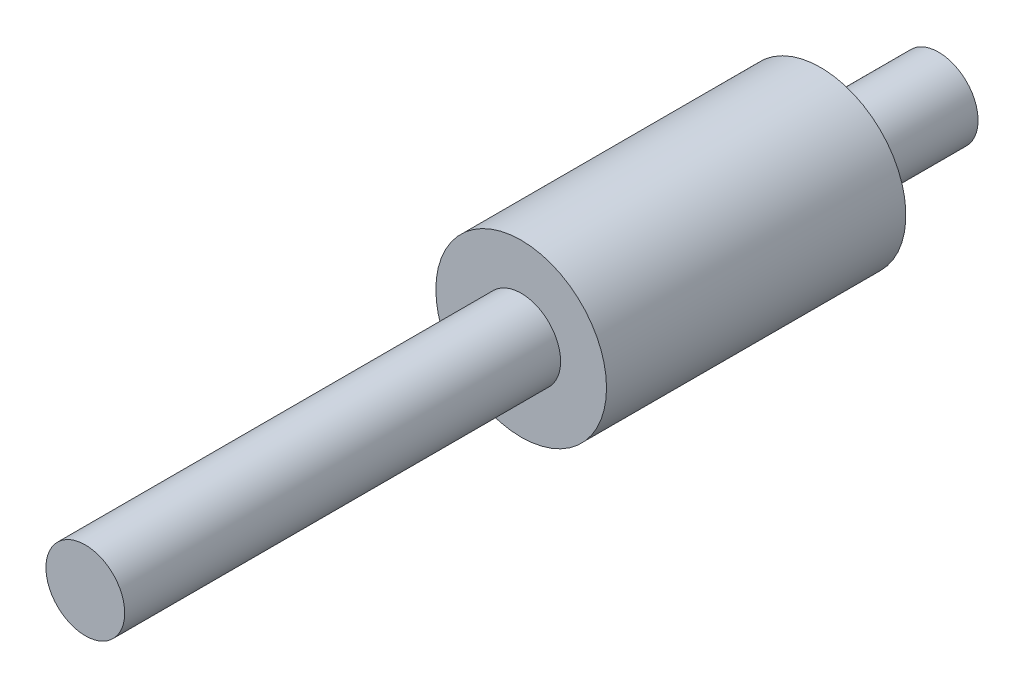
ISO-10303-21;
HEADER;
FILE_DESCRIPTION(('STEP AP214'),'2;1');
FILE_NAME('part.step','',(''),(''),'','','');
FILE_SCHEMA(('AUTOMOTIVE_DESIGN { 1 0 10303 214 1 1 1 1 }'));
ENDSEC;
DATA;
#1=APPLICATION_CONTEXT('core data for automotive mechanical design processes');
#2=APPLICATION_PROTOCOL_DEFINITION('international standard','automotive_design',2000,#1);
#3=PRODUCT_CONTEXT('',#1,'mechanical');
#4=PRODUCT('Part','Part','',(#3));
#5=PRODUCT_RELATED_PRODUCT_CATEGORY('part','',(#4));
#6=PRODUCT_DEFINITION_FORMATION('','',#4);
#7=PRODUCT_DEFINITION_CONTEXT('part definition',#1,'design');
#8=PRODUCT_DEFINITION('design','',#6,#7);
#9=PRODUCT_DEFINITION_SHAPE('','',#8);
#10=(LENGTH_UNIT() NAMED_UNIT(*) SI_UNIT(.MILLI.,.METRE.));
#11=(NAMED_UNIT(*) PLANE_ANGLE_UNIT() SI_UNIT($,.RADIAN.));
#12=(NAMED_UNIT(*) SI_UNIT($,.STERADIAN.) SOLID_ANGLE_UNIT());
#13=UNCERTAINTY_MEASURE_WITH_UNIT(LENGTH_MEASURE(1.E-05),#10,'distance_accuracy_value','');
#14=(GEOMETRIC_REPRESENTATION_CONTEXT(3) GLOBAL_UNCERTAINTY_ASSIGNED_CONTEXT((#13)) GLOBAL_UNIT_ASSIGNED_CONTEXT((#10,
#11,#12)) REPRESENTATION_CONTEXT('',''));
#15=CARTESIAN_POINT('',(0.,0.,0.));
#16=DIRECTION('',(0.,0.,1.));
#17=DIRECTION('',(1.,0.,0.));
#18=AXIS2_PLACEMENT_3D('',#15,#16,#17);
#19=CARTESIAN_POINT('',(0.,0.,65.));
#20=DIRECTION('',(0.,0.,-1.));
#21=DIRECTION('',(-1.,0.,0.));
#22=AXIS2_PLACEMENT_3D('',#19,#20,#21);
#23=CYLINDRICAL_SURFACE('',#22,6.5);
#24=CARTESIAN_POINT('',(0.,0.,31.8));
#25=DIRECTION('',(0.,0.,1.));
#26=DIRECTION('',(1.,0.,0.));
#27=AXIS2_PLACEMENT_3D('',#24,#25,#26);
#28=CIRCLE('',#27,6.5);
#29=CARTESIAN_POINT('',(6.5,0.,31.8));
#30=VERTEX_POINT('',#29);
#31=EDGE_CURVE('E10',#30,#30,#28,.T.);
#32=ORIENTED_EDGE('',*,*,#31,.F.);
#33=EDGE_LOOP('',(#32));
#34=FACE_BOUND('',#33,.T.);
#35=CARTESIAN_POINT('',(0.,0.,9.));
#36=DIRECTION('',(0.,0.,-1.));
#37=DIRECTION('',(-1.,0.,0.));
#38=AXIS2_PLACEMENT_3D('',#35,#36,#37);
#39=CIRCLE('',#38,6.5);
#40=CARTESIAN_POINT('',(-6.5,0.,9.));
#41=VERTEX_POINT('',#40);
#42=EDGE_CURVE('E47',#41,#41,#39,.T.);
#43=ORIENTED_EDGE('',*,*,#42,.F.);
#44=EDGE_LOOP('',(#43));
#45=FACE_BOUND('',#44,.T.);
#46=ADVANCED_FACE('F32',(#34,#45),#23,.T.);
#47=CARTESIAN_POINT('',(0.,0.,31.8));
#48=DIRECTION('',(0.,0.,1.));
#49=DIRECTION('',(1.,0.,0.));
#50=AXIS2_PLACEMENT_3D('',#47,#48,#49);
#51=PLANE('',#50);
#52=CARTESIAN_POINT('',(0.,0.,31.8));
#53=DIRECTION('',(0.,0.,1.));
#54=DIRECTION('',(1.,0.,0.));
#55=AXIS2_PLACEMENT_3D('',#52,#53,#54);
#56=CIRCLE('',#55,3.);
#57=CARTESIAN_POINT('',(3.,0.,31.8));
#58=VERTEX_POINT('',#57);
#59=EDGE_CURVE('E38',#58,#58,#56,.T.);
#60=ORIENTED_EDGE('',*,*,#59,.F.);
#61=EDGE_LOOP('',(#60));
#62=FACE_BOUND('',#61,.T.);
#63=ORIENTED_EDGE('',*,*,#31,.T.);
#64=EDGE_LOOP('',(#63));
#65=FACE_BOUND('',#64,.T.);
#66=ADVANCED_FACE('F69',(#62,#65),#51,.T.);
#67=CARTESIAN_POINT('',(0.,0.,31.8));
#68=DIRECTION('',(0.,0.,1.));
#69=DIRECTION('',(1.,0.,0.));
#70=AXIS2_PLACEMENT_3D('',#67,#68,#69);
#71=CYLINDRICAL_SURFACE('',#70,3.);
#72=CARTESIAN_POINT('',(0.,0.,65.));
#73=DIRECTION('',(0.,0.,1.));
#74=DIRECTION('',(1.,0.,0.));
#75=AXIS2_PLACEMENT_3D('',#72,#73,#74);
#76=CIRCLE('',#75,3.);
#77=CARTESIAN_POINT('',(3.,0.,65.));
#78=VERTEX_POINT('',#77);
#79=EDGE_CURVE('E42',#78,#78,#76,.T.);
#80=CARTESIAN_POINT('',(3.,0.,31.8));
#81=CARTESIAN_POINT('',(3.,0.,32.1458333333333));
#82=CARTESIAN_POINT('',(3.,0.,32.4916666666667));
#83=CARTESIAN_POINT('',(3.,0.,33.1833333333333));
#84=CARTESIAN_POINT('',(3.,0.,33.5291666666667));
#85=CARTESIAN_POINT('',(3.,0.,34.2208333333333));
#86=CARTESIAN_POINT('',(3.,0.,34.5666666666667));
#87=CARTESIAN_POINT('',(3.,0.,35.2583333333333));
#88=CARTESIAN_POINT('',(3.,0.,35.6041666666667));
#89=CARTESIAN_POINT('',(3.,0.,36.2958333333333));
#90=CARTESIAN_POINT('',(3.,0.,36.6416666666667));
#91=CARTESIAN_POINT('',(3.,0.,37.3333333333333));
#92=CARTESIAN_POINT('',(3.,0.,37.6791666666667));
#93=CARTESIAN_POINT('',(3.,0.,38.3708333333333));
#94=CARTESIAN_POINT('',(3.,0.,38.7166666666667));
#95=CARTESIAN_POINT('',(3.,0.,39.4083333333333));
#96=CARTESIAN_POINT('',(3.,0.,39.7541666666667));
#97=CARTESIAN_POINT('',(3.,0.,40.4458333333333));
#98=CARTESIAN_POINT('',(3.,0.,40.7916666666667));
#99=CARTESIAN_POINT('',(3.,0.,41.4833333333333));
#100=CARTESIAN_POINT('',(3.,0.,41.8291666666667));
#101=CARTESIAN_POINT('',(3.,0.,42.5208333333333));
#102=CARTESIAN_POINT('',(3.,0.,42.8666666666667));
#103=CARTESIAN_POINT('',(3.,0.,43.5583333333333));
#104=CARTESIAN_POINT('',(3.,0.,43.9041666666667));
#105=CARTESIAN_POINT('',(3.,0.,44.5958333333333));
#106=CARTESIAN_POINT('',(3.,0.,44.9416666666667));
#107=CARTESIAN_POINT('',(3.,0.,45.6333333333333));
#108=CARTESIAN_POINT('',(3.,0.,45.9791666666667));
#109=CARTESIAN_POINT('',(3.,0.,46.6708333333333));
#110=CARTESIAN_POINT('',(3.,0.,47.0166666666667));
#111=CARTESIAN_POINT('',(3.,0.,47.7083333333333));
#112=CARTESIAN_POINT('',(3.,0.,48.0541666666667));
#113=CARTESIAN_POINT('',(3.,0.,48.7458333333333));
#114=CARTESIAN_POINT('',(3.,0.,49.0916666666667));
#115=CARTESIAN_POINT('',(3.,0.,49.7833333333333));
#116=CARTESIAN_POINT('',(3.,0.,50.1291666666667));
#117=CARTESIAN_POINT('',(3.,0.,50.8208333333333));
#118=CARTESIAN_POINT('',(3.,0.,51.1666666666667));
#119=CARTESIAN_POINT('',(3.,0.,51.8583333333333));
#120=CARTESIAN_POINT('',(3.,0.,52.2041666666667));
#121=CARTESIAN_POINT('',(3.,0.,52.8958333333333));
#122=CARTESIAN_POINT('',(3.,0.,53.2416666666667));
#123=CARTESIAN_POINT('',(3.,0.,53.9333333333333));
#124=CARTESIAN_POINT('',(3.,0.,54.2791666666667));
#125=CARTESIAN_POINT('',(3.,0.,54.9708333333333));
#126=CARTESIAN_POINT('',(3.,0.,55.3166666666667));
#127=CARTESIAN_POINT('',(3.,0.,56.0083333333333));
#128=CARTESIAN_POINT('',(3.,0.,56.3541666666667));
#129=CARTESIAN_POINT('',(3.,0.,57.0458333333333));
#130=CARTESIAN_POINT('',(3.,0.,57.3916666666667));
#131=CARTESIAN_POINT('',(3.,0.,58.0833333333333));
#132=CARTESIAN_POINT('',(3.,0.,58.4291666666667));
#133=CARTESIAN_POINT('',(3.,0.,59.1208333333333));
#134=CARTESIAN_POINT('',(3.,0.,59.4666666666667));
#135=CARTESIAN_POINT('',(3.,0.,60.1583333333333));
#136=CARTESIAN_POINT('',(3.,0.,60.5041666666667));
#137=CARTESIAN_POINT('',(3.,0.,61.1958333333333));
#138=CARTESIAN_POINT('',(3.,0.,61.5416666666667));
#139=CARTESIAN_POINT('',(3.,0.,62.2333333333333));
#140=CARTESIAN_POINT('',(3.,0.,62.5791666666667));
#141=CARTESIAN_POINT('',(3.,0.,63.2708333333333));
#142=CARTESIAN_POINT('',(3.,0.,63.6166666666667));
#143=CARTESIAN_POINT('',(3.,0.,64.3083333333333));
#144=CARTESIAN_POINT('',(3.,0.,64.6541666666667));
#145=CARTESIAN_POINT('',(3.,0.,65.));
#146=B_SPLINE_CURVE_WITH_KNOTS('',3,(#80,#81,#82,#83,#84,#85,#86,#87,#88,#89,#90,#91,#92,#93,
#94,#95,#96,#97,#98,#99,#100,#101,#102,#103,#104,#105,#106,#107,#108,#109,#110,#111,#112,#113,
#114,#115,#116,#117,#118,#119,#120,#121,#122,#123,#124,#125,#126,#127,#128,#129,#130,#131,#132,
#133,#134,#135,#136,#137,#138,#139,#140,#141,#142,#143,#144,#145),.UNSPECIFIED.,.F.,.F.,(4,2,2,
2,2,2,2,2,2,2,2,2,2,2,2,2,2,2,2,2,2,2,2,2,2,2,2,2,2,2,2,2,4),(0.,1.0375,2.075,3.1125,4.15,
5.1875,6.225,7.2625,8.3,9.3375,10.375,11.4125,12.45,13.4875,14.525,15.5625,16.6,17.6375,18.675,
19.7125,20.75,21.7875,22.825,23.8625,24.9,25.9375,26.975,28.0125,29.05,30.0875,31.125,32.1625,
33.2),.UNSPECIFIED.);
#147=EDGE_CURVE('BSEAM74',#58,#78,#146,.T.);
#148=ORIENTED_EDGE('',*,*,#59,.T.);
#149=ORIENTED_EDGE('',*,*,#79,.F.);
#150=ORIENTED_EDGE('',*,*,#147,.T.);
#151=ORIENTED_EDGE('',*,*,#147,.F.);
#152=EDGE_LOOP('',(#148,#150,#149,#151));
#153=FACE_BOUND('',#152,.T.);
#154=ADVANCED_FACE('F74',(#153),#71,.T.);
#155=CARTESIAN_POINT('',(0.,0.,65.));
#156=DIRECTION('',(0.,0.,1.));
#157=DIRECTION('',(1.,0.,0.));
#158=AXIS2_PLACEMENT_3D('',#155,#156,#157);
#159=PLANE('',#158);
#160=ORIENTED_EDGE('',*,*,#79,.T.);
#161=EDGE_LOOP('',(#160));
#162=FACE_BOUND('',#161,.T.);
#163=ADVANCED_FACE('F64',(#162),#159,.T.);
#164=CARTESIAN_POINT('',(0.,0.,9.));
#165=DIRECTION('',(0.,0.,-1.));
#166=DIRECTION('',(-1.,0.,0.));
#167=AXIS2_PLACEMENT_3D('',#164,#165,#166);
#168=PLANE('',#167);
#169=CARTESIAN_POINT('',(0.,0.,9.));
#170=DIRECTION('',(0.,0.,-1.));
#171=DIRECTION('',(-1.,0.,0.));
#172=AXIS2_PLACEMENT_3D('',#169,#170,#171);
#173=CIRCLE('',#172,3.);
#174=CARTESIAN_POINT('',(-3.,0.,9.));
#175=VERTEX_POINT('',#174);
#176=EDGE_CURVE('E51',#175,#175,#173,.T.);
#177=ORIENTED_EDGE('',*,*,#176,.F.);
#178=EDGE_LOOP('',(#177));
#179=FACE_BOUND('',#178,.T.);
#180=ORIENTED_EDGE('',*,*,#42,.T.);
#181=EDGE_LOOP('',(#180));
#182=FACE_BOUND('',#181,.T.);
#183=ADVANCED_FACE('F61',(#179,#182),#168,.T.);
#184=CARTESIAN_POINT('',(0.,0.,9.));
#185=DIRECTION('',(0.,0.,-1.));
#186=DIRECTION('',(-1.,0.,0.));
#187=AXIS2_PLACEMENT_3D('',#184,#185,#186);
#188=CYLINDRICAL_SURFACE('',#187,3.);
#189=ORIENTED_EDGE('',*,*,#176,.T.);
#190=EDGE_LOOP('',(#189));
#191=FACE_BOUND('',#190,.T.);
#192=CARTESIAN_POINT('',(0.,0.,0.));
#193=DIRECTION('',(0.,0.,-1.));
#194=DIRECTION('',(-1.,0.,0.));
#195=AXIS2_PLACEMENT_3D('',#192,#193,#194);
#196=CIRCLE('',#195,3.);
#197=CARTESIAN_POINT('',(-3.,0.,0.));
#198=VERTEX_POINT('',#197);
#199=EDGE_CURVE('E52',#198,#198,#196,.T.);
#200=ORIENTED_EDGE('',*,*,#199,.F.);
#201=EDGE_LOOP('',(#200));
#202=FACE_BOUND('',#201,.T.);
#203=ADVANCED_FACE('F58',(#191,#202),#188,.T.);
#204=CARTESIAN_POINT('',(0.,0.,0.));
#205=DIRECTION('',(0.,0.,1.));
#206=DIRECTION('',(1.,0.,0.));
#207=AXIS2_PLACEMENT_3D('',#204,#205,#206);
#208=PLANE('',#207);
#209=ORIENTED_EDGE('',*,*,#199,.T.);
#210=EDGE_LOOP('',(#209));
#211=FACE_BOUND('',#210,.T.);
#212=ADVANCED_FACE('F84',(#211),#208,.F.);
#213=CLOSED_SHELL('',(#46,#66,#154,#163,#183,#203,#212));
#214=MANIFOLD_SOLID_BREP('B2',#213);
#215=ADVANCED_BREP_SHAPE_REPRESENTATION('',(#18,#214),#14);
#216=SHAPE_DEFINITION_REPRESENTATION(#9,#215);
ENDSEC;
END-ISO-10303-21;
